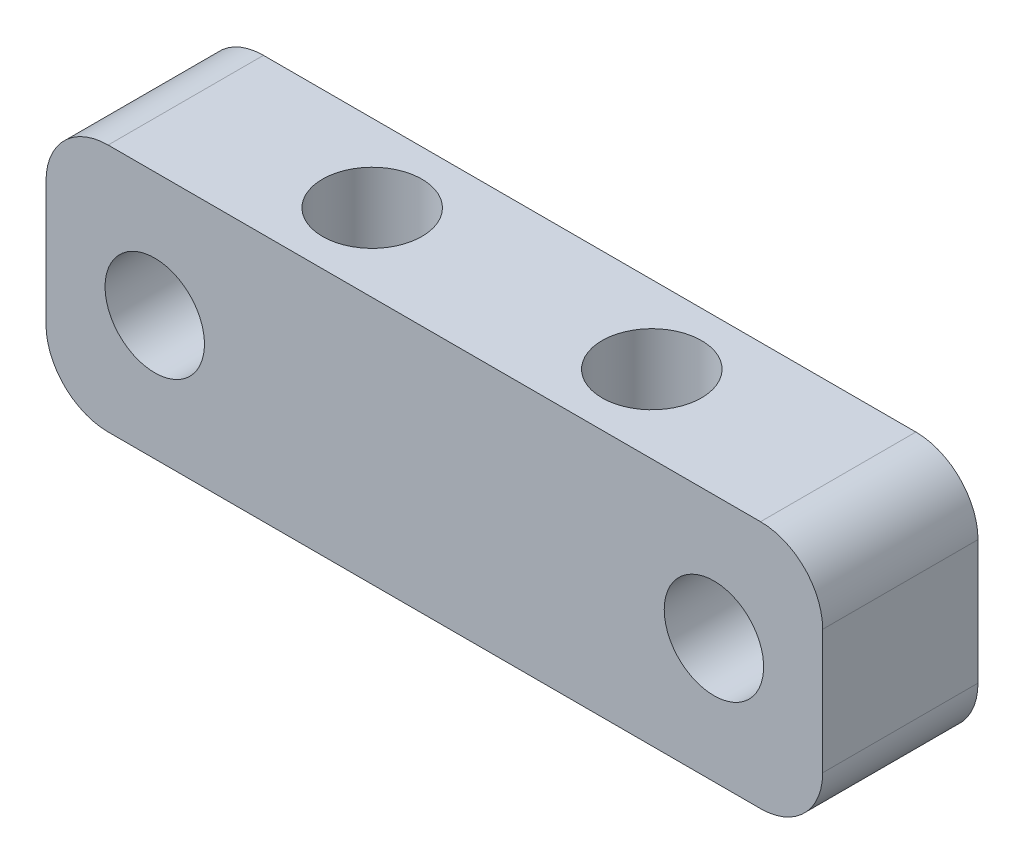
ISO-10303-21;
HEADER;
FILE_DESCRIPTION(('STEP AP214'),'2;1');
FILE_NAME('part.step','',(''),(''),'','','');
FILE_SCHEMA(('AUTOMOTIVE_DESIGN { 1 0 10303 214 1 1 1 1 }'));
ENDSEC;
DATA;
#1=APPLICATION_CONTEXT('core data for automotive mechanical design processes');
#2=APPLICATION_PROTOCOL_DEFINITION('international standard','automotive_design',2000,#1);
#3=PRODUCT_CONTEXT('',#1,'mechanical');
#4=PRODUCT('Part','Part','',(#3));
#5=PRODUCT_RELATED_PRODUCT_CATEGORY('part','',(#4));
#6=PRODUCT_DEFINITION_FORMATION('','',#4);
#7=PRODUCT_DEFINITION_CONTEXT('part definition',#1,'design');
#8=PRODUCT_DEFINITION('design','',#6,#7);
#9=PRODUCT_DEFINITION_SHAPE('','',#8);
#10=(LENGTH_UNIT() NAMED_UNIT(*) SI_UNIT(.MILLI.,.METRE.));
#11=(NAMED_UNIT(*) PLANE_ANGLE_UNIT() SI_UNIT($,.RADIAN.));
#12=(NAMED_UNIT(*) SI_UNIT($,.STERADIAN.) SOLID_ANGLE_UNIT());
#13=UNCERTAINTY_MEASURE_WITH_UNIT(LENGTH_MEASURE(1.E-05),#10,'distance_accuracy_value','');
#14=(GEOMETRIC_REPRESENTATION_CONTEXT(3) GLOBAL_UNCERTAINTY_ASSIGNED_CONTEXT((#13)) GLOBAL_UNIT_ASSIGNED_CONTEXT((#10,
#11,#12)) REPRESENTATION_CONTEXT('',''));
#15=CARTESIAN_POINT('',(0.,0.,0.));
#16=DIRECTION('',(0.,0.,1.));
#17=DIRECTION('',(1.,0.,0.));
#18=AXIS2_PLACEMENT_3D('',#15,#16,#17);
#19=CARTESIAN_POINT('',(0.,8.,0.));
#20=DIRECTION('',(0.,-1.,0.));
#21=DIRECTION('',(0.,0.,-1.));
#22=AXIS2_PLACEMENT_3D('',#19,#20,#21);
#23=PLANE('',#22);
#24=DIRECTION('',(-1.,0.,0.));
#25=VECTOR('',#24,1.);
#26=CARTESIAN_POINT('',(0.,8.,-5.));
#27=LINE('',#26,#25);
#28=CARTESIAN_POINT('',(23.,8.,-5.));
#29=VERTEX_POINT('',#28);
#30=CARTESIAN_POINT('',(2.,8.,-5.));
#31=VERTEX_POINT('',#30);
#32=EDGE_CURVE('E127',#29,#31,#27,.T.);
#33=ORIENTED_EDGE('',*,*,#32,.T.);
#34=DIRECTION('',(0.,0.,1.));
#35=VECTOR('',#34,1.);
#36=CARTESIAN_POINT('',(2.,8.,0.));
#37=LINE('',#36,#35);
#38=CARTESIAN_POINT('',(2.,8.,0.));
#39=VERTEX_POINT('',#38);
#40=EDGE_CURVE('E111',#31,#39,#37,.T.);
#41=ORIENTED_EDGE('',*,*,#40,.T.);
#42=DIRECTION('',(1.,0.,0.));
#43=VECTOR('',#42,1.);
#44=CARTESIAN_POINT('',(0.,8.,0.));
#45=LINE('',#44,#43);
#46=CARTESIAN_POINT('',(23.,8.,0.));
#47=VERTEX_POINT('',#46);
#48=EDGE_CURVE('E125',#39,#47,#45,.T.);
#49=ORIENTED_EDGE('',*,*,#48,.T.);
#50=DIRECTION('',(0.,0.,-1.));
#51=VECTOR('',#50,1.);
#52=CARTESIAN_POINT('',(23.,8.,0.));
#53=LINE('',#52,#51);
#54=EDGE_CURVE('E129',#47,#29,#53,.T.);
#55=ORIENTED_EDGE('',*,*,#54,.T.);
#56=EDGE_LOOP('',(#33,#41,#49,#55));
#57=FACE_BOUND('',#56,.T.);
#58=CARTESIAN_POINT('',(8.,8.,-2.5));
#59=DIRECTION('',(0.,1.,0.));
#60=DIRECTION('',(0.,0.,1.));
#61=AXIS2_PLACEMENT_3D('',#58,#59,#60);
#62=CIRCLE('',#61,1.6);
#63=CARTESIAN_POINT('',(8.,8.,-0.899999999999998));
#64=VERTEX_POINT('',#63);
#65=EDGE_CURVE('E146',#64,#64,#62,.T.);
#66=ORIENTED_EDGE('',*,*,#65,.F.);
#67=EDGE_LOOP('',(#66));
#68=FACE_BOUND('',#67,.T.);
#69=CARTESIAN_POINT('',(17.,8.,-2.5));
#70=DIRECTION('',(0.,1.,0.));
#71=DIRECTION('',(0.,0.,1.));
#72=AXIS2_PLACEMENT_3D('',#69,#70,#71);
#73=CIRCLE('',#72,1.6);
#74=CARTESIAN_POINT('',(17.,8.,-0.899999999999998));
#75=VERTEX_POINT('',#74);
#76=EDGE_CURVE('E246',#75,#75,#73,.T.);
#77=ORIENTED_EDGE('',*,*,#76,.F.);
#78=EDGE_LOOP('',(#77));
#79=FACE_BOUND('',#78,.T.);
#80=ADVANCED_FACE('F41',(#57,#68,#79),#23,.F.);
#81=CARTESIAN_POINT('',(0.,0.,0.));
#82=DIRECTION('',(0.,-1.,0.));
#83=DIRECTION('',(0.,0.,-1.));
#84=AXIS2_PLACEMENT_3D('',#81,#82,#83);
#85=PLANE('',#84);
#86=CARTESIAN_POINT('',(8.,0.,-2.5));
#87=DIRECTION('',(0.,1.,0.));
#88=DIRECTION('',(0.,0.,1.));
#89=AXIS2_PLACEMENT_3D('',#86,#87,#88);
#90=CIRCLE('',#89,1.6);
#91=CARTESIAN_POINT('',(8.,0.,-0.899999999999998));
#92=VERTEX_POINT('',#91);
#93=EDGE_CURVE('E142',#92,#92,#90,.T.);
#94=ORIENTED_EDGE('',*,*,#93,.T.);
#95=EDGE_LOOP('',(#94));
#96=FACE_BOUND('',#95,.T.);
#97=DIRECTION('',(1.,0.,0.));
#98=VECTOR('',#97,1.);
#99=CARTESIAN_POINT('',(0.,0.,0.));
#100=LINE('',#99,#98);
#101=CARTESIAN_POINT('',(2.,0.,0.));
#102=VERTEX_POINT('',#101);
#103=CARTESIAN_POINT('',(23.,0.,0.));
#104=VERTEX_POINT('',#103);
#105=EDGE_CURVE('E139',#102,#104,#100,.T.);
#106=ORIENTED_EDGE('',*,*,#105,.F.);
#107=DIRECTION('',(0.,0.,1.));
#108=VECTOR('',#107,1.);
#109=CARTESIAN_POINT('',(2.,0.,-5.));
#110=LINE('',#109,#108);
#111=CARTESIAN_POINT('',(2.,0.,-5.));
#112=VERTEX_POINT('',#111);
#113=EDGE_CURVE('E173',#102,#112,#110,.F.);
#114=ORIENTED_EDGE('',*,*,#113,.T.);
#115=DIRECTION('',(-1.,0.,0.));
#116=VECTOR('',#115,1.);
#117=CARTESIAN_POINT('',(0.,0.,-5.));
#118=LINE('',#117,#116);
#119=CARTESIAN_POINT('',(23.,0.,-5.));
#120=VERTEX_POINT('',#119);
#121=EDGE_CURVE('E134',#120,#112,#118,.T.);
#122=ORIENTED_EDGE('',*,*,#121,.F.);
#123=DIRECTION('',(0.,0.,-1.));
#124=VECTOR('',#123,1.);
#125=CARTESIAN_POINT('',(23.,0.,0.));
#126=LINE('',#125,#124);
#127=EDGE_CURVE('E171',#120,#104,#126,.F.);
#128=ORIENTED_EDGE('',*,*,#127,.T.);
#129=EDGE_LOOP('',(#106,#114,#122,#128));
#130=FACE_BOUND('',#129,.T.);
#131=CARTESIAN_POINT('',(17.,0.,-2.5));
#132=DIRECTION('',(0.,1.,0.));
#133=DIRECTION('',(0.,0.,1.));
#134=AXIS2_PLACEMENT_3D('',#131,#132,#133);
#135=CIRCLE('',#134,1.6);
#136=CARTESIAN_POINT('',(17.,0.,-0.899999999999998));
#137=VERTEX_POINT('',#136);
#138=EDGE_CURVE('E249',#137,#137,#135,.T.);
#139=ORIENTED_EDGE('',*,*,#138,.T.);
#140=EDGE_LOOP('',(#139));
#141=FACE_BOUND('',#140,.T.);
#142=ADVANCED_FACE('F190',(#96,#130,#141),#85,.T.);
#143=CARTESIAN_POINT('',(0.,8.,0.));
#144=DIRECTION('',(1.,0.,0.));
#145=DIRECTION('',(0.,0.,-1.));
#146=AXIS2_PLACEMENT_3D('',#143,#144,#145);
#147=PLANE('',#146);
#148=DIRECTION('',(0.,-1.,0.));
#149=VECTOR('',#148,1.);
#150=CARTESIAN_POINT('',(0.,8.,0.));
#151=LINE('',#150,#149);
#152=CARTESIAN_POINT('',(0.,6.,0.));
#153=VERTEX_POINT('',#152);
#154=CARTESIAN_POINT('',(0.,2.,0.));
#155=VERTEX_POINT('',#154);
#156=EDGE_CURVE('E155',#153,#155,#151,.T.);
#157=ORIENTED_EDGE('',*,*,#156,.F.);
#158=DIRECTION('',(0.,0.,1.));
#159=VECTOR('',#158,1.);
#160=CARTESIAN_POINT('',(0.,6.,0.));
#161=LINE('',#160,#159);
#162=CARTESIAN_POINT('',(0.,6.,-5.));
#163=VERTEX_POINT('',#162);
#164=EDGE_CURVE('E112',#153,#163,#161,.F.);
#165=ORIENTED_EDGE('',*,*,#164,.T.);
#166=DIRECTION('',(0.,-1.,0.));
#167=VECTOR('',#166,1.);
#168=CARTESIAN_POINT('',(0.,8.,-5.));
#169=LINE('',#168,#167);
#170=CARTESIAN_POINT('',(0.,2.,-5.));
#171=VERTEX_POINT('',#170);
#172=EDGE_CURVE('E136',#163,#171,#169,.T.);
#173=ORIENTED_EDGE('',*,*,#172,.T.);
#174=DIRECTION('',(0.,0.,1.));
#175=VECTOR('',#174,1.);
#176=CARTESIAN_POINT('',(0.,2.,0.));
#177=LINE('',#176,#175);
#178=EDGE_CURVE('E117',#171,#155,#177,.T.);
#179=ORIENTED_EDGE('',*,*,#178,.T.);
#180=EDGE_LOOP('',(#157,#165,#173,#179));
#181=FACE_BOUND('',#180,.T.);
#182=ADVANCED_FACE('F184',(#181),#147,.F.);
#183=CARTESIAN_POINT('',(0.,8.,0.));
#184=DIRECTION('',(0.,0.,-1.));
#185=DIRECTION('',(-1.,0.,0.));
#186=AXIS2_PLACEMENT_3D('',#183,#184,#185);
#187=PLANE('',#186);
#188=CARTESIAN_POINT('',(3.5,4.,0.));
#189=DIRECTION('',(0.,0.,-1.));
#190=DIRECTION('',(-1.,0.,0.));
#191=AXIS2_PLACEMENT_3D('',#188,#189,#190);
#192=CIRCLE('',#191,1.6);
#193=CARTESIAN_POINT('',(1.9,4.,0.));
#194=VERTEX_POINT('',#193);
#195=EDGE_CURVE('E250',#194,#194,#192,.T.);
#196=ORIENTED_EDGE('',*,*,#195,.T.);
#197=EDGE_LOOP('',(#196));
#198=FACE_BOUND('',#197,.T.);
#199=CARTESIAN_POINT('',(21.5,4.,0.));
#200=DIRECTION('',(0.,0.,-1.));
#201=DIRECTION('',(-1.,0.,0.));
#202=AXIS2_PLACEMENT_3D('',#199,#200,#201);
#203=CIRCLE('',#202,1.6);
#204=CARTESIAN_POINT('',(19.9,4.,0.));
#205=VERTEX_POINT('',#204);
#206=EDGE_CURVE('E254',#205,#205,#203,.T.);
#207=ORIENTED_EDGE('',*,*,#206,.T.);
#208=EDGE_LOOP('',(#207));
#209=FACE_BOUND('',#208,.T.);
#210=ORIENTED_EDGE('',*,*,#48,.F.);
#211=CARTESIAN_POINT('',(2.,6.,0.));
#212=DIRECTION('',(0.,0.,-1.));
#213=DIRECTION('',(-1.,0.,0.));
#214=AXIS2_PLACEMENT_3D('',#211,#212,#213);
#215=CIRCLE('',#214,2.);
#216=EDGE_CURVE('E107',#39,#153,#215,.F.);
#217=ORIENTED_EDGE('',*,*,#216,.T.);
#218=ORIENTED_EDGE('',*,*,#156,.T.);
#219=CARTESIAN_POINT('',(2.,2.,0.));
#220=DIRECTION('',(0.,0.,-1.));
#221=DIRECTION('',(-1.,0.,0.));
#222=AXIS2_PLACEMENT_3D('',#219,#220,#221);
#223=CIRCLE('',#222,2.);
#224=EDGE_CURVE('E118',#155,#102,#223,.F.);
#225=ORIENTED_EDGE('',*,*,#224,.T.);
#226=ORIENTED_EDGE('',*,*,#105,.T.);
#227=CARTESIAN_POINT('',(23.,2.,0.));
#228=DIRECTION('',(0.,0.,-1.));
#229=DIRECTION('',(-1.,0.,0.));
#230=AXIS2_PLACEMENT_3D('',#227,#228,#229);
#231=CIRCLE('',#230,2.);
#232=CARTESIAN_POINT('',(25.,2.,0.));
#233=VERTEX_POINT('',#232);
#234=EDGE_CURVE('E159',#104,#233,#231,.F.);
#235=ORIENTED_EDGE('',*,*,#234,.T.);
#236=DIRECTION('',(0.,-1.,0.));
#237=VECTOR('',#236,1.);
#238=CARTESIAN_POINT('',(25.,8.,0.));
#239=LINE('',#238,#237);
#240=CARTESIAN_POINT('',(25.,6.,0.));
#241=VERTEX_POINT('',#240);
#242=EDGE_CURVE('E152',#241,#233,#239,.T.);
#243=ORIENTED_EDGE('',*,*,#242,.F.);
#244=CARTESIAN_POINT('',(23.,6.,0.));
#245=DIRECTION('',(0.,0.,-1.));
#246=DIRECTION('',(-1.,0.,0.));
#247=AXIS2_PLACEMENT_3D('',#244,#245,#246);
#248=CIRCLE('',#247,2.);
#249=EDGE_CURVE('E128',#241,#47,#248,.F.);
#250=ORIENTED_EDGE('',*,*,#249,.T.);
#251=EDGE_LOOP('',(#210,#217,#218,#225,#226,#235,#243,#250));
#252=FACE_BOUND('',#251,.T.);
#253=ADVANCED_FACE('F131',(#198,#209,#252),#187,.F.);
#254=CARTESIAN_POINT('',(25.,8.,0.));
#255=DIRECTION('',(-1.,0.,0.));
#256=DIRECTION('',(0.,0.,1.));
#257=AXIS2_PLACEMENT_3D('',#254,#255,#256);
#258=PLANE('',#257);
#259=ORIENTED_EDGE('',*,*,#242,.T.);
#260=DIRECTION('',(0.,0.,-1.));
#261=VECTOR('',#260,1.);
#262=CARTESIAN_POINT('',(25.,2.,-5.));
#263=LINE('',#262,#261);
#264=CARTESIAN_POINT('',(25.,2.,-5.));
#265=VERTEX_POINT('',#264);
#266=EDGE_CURVE('E11',#233,#265,#263,.T.);
#267=ORIENTED_EDGE('',*,*,#266,.T.);
#268=DIRECTION('',(0.,-1.,0.));
#269=VECTOR('',#268,1.);
#270=CARTESIAN_POINT('',(25.,8.,-5.));
#271=LINE('',#270,#269);
#272=CARTESIAN_POINT('',(25.,6.,-5.));
#273=VERTEX_POINT('',#272);
#274=EDGE_CURVE('E150',#273,#265,#271,.T.);
#275=ORIENTED_EDGE('',*,*,#274,.F.);
#276=DIRECTION('',(0.,0.,-1.));
#277=VECTOR('',#276,1.);
#278=CARTESIAN_POINT('',(25.,6.,0.));
#279=LINE('',#278,#277);
#280=EDGE_CURVE('E49',#273,#241,#279,.F.);
#281=ORIENTED_EDGE('',*,*,#280,.T.);
#282=EDGE_LOOP('',(#259,#267,#275,#281));
#283=FACE_BOUND('',#282,.T.);
#284=ADVANCED_FACE('F176',(#283),#258,.F.);
#285=CARTESIAN_POINT('',(0.,8.,-5.));
#286=DIRECTION('',(0.,0.,1.));
#287=DIRECTION('',(1.,0.,0.));
#288=AXIS2_PLACEMENT_3D('',#285,#286,#287);
#289=PLANE('',#288);
#290=CARTESIAN_POINT('',(3.5,4.,-5.));
#291=DIRECTION('',(0.,0.,-1.));
#292=DIRECTION('',(-1.,0.,0.));
#293=AXIS2_PLACEMENT_3D('',#290,#291,#292);
#294=CIRCLE('',#293,1.6);
#295=CARTESIAN_POINT('',(1.9,4.,-5.));
#296=VERTEX_POINT('',#295);
#297=EDGE_CURVE('E265',#296,#296,#294,.T.);
#298=ORIENTED_EDGE('',*,*,#297,.F.);
#299=EDGE_LOOP('',(#298));
#300=FACE_BOUND('',#299,.T.);
#301=CARTESIAN_POINT('',(21.5,4.,-5.));
#302=DIRECTION('',(0.,0.,-1.));
#303=DIRECTION('',(-1.,0.,0.));
#304=AXIS2_PLACEMENT_3D('',#301,#302,#303);
#305=CIRCLE('',#304,1.6);
#306=CARTESIAN_POINT('',(19.9,4.,-5.));
#307=VERTEX_POINT('',#306);
#308=EDGE_CURVE('E266',#307,#307,#305,.T.);
#309=ORIENTED_EDGE('',*,*,#308,.F.);
#310=EDGE_LOOP('',(#309));
#311=FACE_BOUND('',#310,.T.);
#312=ORIENTED_EDGE('',*,*,#172,.F.);
#313=CARTESIAN_POINT('',(2.,6.,-5.));
#314=DIRECTION('',(0.,0.,1.));
#315=DIRECTION('',(1.,0.,0.));
#316=AXIS2_PLACEMENT_3D('',#313,#314,#315);
#317=CIRCLE('',#316,2.);
#318=EDGE_CURVE('E169',#163,#31,#317,.F.);
#319=ORIENTED_EDGE('',*,*,#318,.T.);
#320=ORIENTED_EDGE('',*,*,#32,.F.);
#321=CARTESIAN_POINT('',(23.,6.,-5.));
#322=DIRECTION('',(0.,0.,1.));
#323=DIRECTION('',(1.,0.,0.));
#324=AXIS2_PLACEMENT_3D('',#321,#322,#323);
#325=CIRCLE('',#324,2.);
#326=EDGE_CURVE('E63',#29,#273,#325,.F.);
#327=ORIENTED_EDGE('',*,*,#326,.T.);
#328=ORIENTED_EDGE('',*,*,#274,.T.);
#329=CARTESIAN_POINT('',(23.,2.,-5.));
#330=DIRECTION('',(0.,0.,1.));
#331=DIRECTION('',(1.,0.,0.));
#332=AXIS2_PLACEMENT_3D('',#329,#330,#331);
#333=CIRCLE('',#332,2.);
#334=EDGE_CURVE('E56',#265,#120,#333,.F.);
#335=ORIENTED_EDGE('',*,*,#334,.T.);
#336=ORIENTED_EDGE('',*,*,#121,.T.);
#337=CARTESIAN_POINT('',(2.,2.,-5.));
#338=DIRECTION('',(0.,0.,1.));
#339=DIRECTION('',(1.,0.,0.));
#340=AXIS2_PLACEMENT_3D('',#337,#338,#339);
#341=CIRCLE('',#340,2.);
#342=EDGE_CURVE('E167',#112,#171,#341,.F.);
#343=ORIENTED_EDGE('',*,*,#342,.T.);
#344=EDGE_LOOP('',(#312,#319,#320,#327,#328,#335,#336,#343));
#345=FACE_BOUND('',#344,.T.);
#346=ADVANCED_FACE('F180',(#300,#311,#345),#289,.F.);
#347=CARTESIAN_POINT('',(8.,8.,-2.5));
#348=DIRECTION('',(0.,-1.,0.));
#349=DIRECTION('',(0.,0.,-1.));
#350=AXIS2_PLACEMENT_3D('',#347,#348,#349);
#351=CYLINDRICAL_SURFACE('',#350,1.6);
#352=ORIENTED_EDGE('',*,*,#65,.T.);
#353=EDGE_LOOP('',(#352));
#354=FACE_BOUND('',#353,.T.);
#355=ORIENTED_EDGE('',*,*,#93,.F.);
#356=EDGE_LOOP('',(#355));
#357=FACE_BOUND('',#356,.T.);
#358=ADVANCED_FACE('F208',(#354,#357),#351,.F.);
#359=CARTESIAN_POINT('',(17.,8.,-2.5));
#360=DIRECTION('',(0.,-1.,0.));
#361=DIRECTION('',(0.,0.,-1.));
#362=AXIS2_PLACEMENT_3D('',#359,#360,#361);
#363=CYLINDRICAL_SURFACE('',#362,1.6);
#364=ORIENTED_EDGE('',*,*,#76,.T.);
#365=EDGE_LOOP('',(#364));
#366=FACE_BOUND('',#365,.T.);
#367=ORIENTED_EDGE('',*,*,#138,.F.);
#368=EDGE_LOOP('',(#367));
#369=FACE_BOUND('',#368,.T.);
#370=ADVANCED_FACE('F232',(#366,#369),#363,.F.);
#371=CARTESIAN_POINT('',(21.5,4.,3.));
#372=DIRECTION('',(0.,0.,-1.));
#373=DIRECTION('',(-1.,0.,0.));
#374=AXIS2_PLACEMENT_3D('',#371,#372,#373);
#375=CYLINDRICAL_SURFACE('',#374,1.6);
#376=ORIENTED_EDGE('',*,*,#308,.T.);
#377=EDGE_LOOP('',(#376));
#378=FACE_BOUND('',#377,.T.);
#379=ORIENTED_EDGE('',*,*,#206,.F.);
#380=EDGE_LOOP('',(#379));
#381=FACE_BOUND('',#380,.T.);
#382=ADVANCED_FACE('F226',(#378,#381),#375,.F.);
#383=CARTESIAN_POINT('',(3.5,4.,3.));
#384=DIRECTION('',(0.,0.,-1.));
#385=DIRECTION('',(-1.,0.,0.));
#386=AXIS2_PLACEMENT_3D('',#383,#384,#385);
#387=CYLINDRICAL_SURFACE('',#386,1.6);
#388=ORIENTED_EDGE('',*,*,#297,.T.);
#389=EDGE_LOOP('',(#388));
#390=FACE_BOUND('',#389,.T.);
#391=ORIENTED_EDGE('',*,*,#195,.F.);
#392=EDGE_LOOP('',(#391));
#393=FACE_BOUND('',#392,.T.);
#394=ADVANCED_FACE('F222',(#390,#393),#387,.F.);
#395=CARTESIAN_POINT('',(2.,6.,0.));
#396=DIRECTION('',(0.,0.,1.));
#397=DIRECTION('',(1.,0.,0.));
#398=AXIS2_PLACEMENT_3D('',#395,#396,#397);
#399=CYLINDRICAL_SURFACE('',#398,2.);
#400=ORIENTED_EDGE('',*,*,#318,.F.);
#401=ORIENTED_EDGE('',*,*,#164,.F.);
#402=ORIENTED_EDGE('',*,*,#216,.F.);
#403=ORIENTED_EDGE('',*,*,#40,.F.);
#404=EDGE_LOOP('',(#400,#401,#402,#403));
#405=FACE_BOUND('',#404,.T.);
#406=ADVANCED_FACE('F110',(#405),#399,.T.);
#407=CARTESIAN_POINT('',(2.,2.,0.));
#408=DIRECTION('',(0.,0.,-1.));
#409=DIRECTION('',(-1.,0.,0.));
#410=AXIS2_PLACEMENT_3D('',#407,#408,#409);
#411=CYLINDRICAL_SURFACE('',#410,2.);
#412=ORIENTED_EDGE('',*,*,#342,.F.);
#413=ORIENTED_EDGE('',*,*,#113,.F.);
#414=ORIENTED_EDGE('',*,*,#224,.F.);
#415=ORIENTED_EDGE('',*,*,#178,.F.);
#416=EDGE_LOOP('',(#412,#413,#414,#415));
#417=FACE_BOUND('',#416,.T.);
#418=ADVANCED_FACE('F186',(#417),#411,.T.);
#419=CARTESIAN_POINT('',(23.,2.,0.));
#420=DIRECTION('',(0.,0.,1.));
#421=DIRECTION('',(1.,0.,0.));
#422=AXIS2_PLACEMENT_3D('',#419,#420,#421);
#423=CYLINDRICAL_SURFACE('',#422,2.);
#424=ORIENTED_EDGE('',*,*,#234,.F.);
#425=ORIENTED_EDGE('',*,*,#127,.F.);
#426=ORIENTED_EDGE('',*,*,#334,.F.);
#427=ORIENTED_EDGE('',*,*,#266,.F.);
#428=EDGE_LOOP('',(#424,#425,#426,#427));
#429=FACE_BOUND('',#428,.T.);
#430=ADVANCED_FACE('F193',(#429),#423,.T.);
#431=CARTESIAN_POINT('',(23.,6.,0.));
#432=DIRECTION('',(0.,0.,-1.));
#433=DIRECTION('',(-1.,0.,0.));
#434=AXIS2_PLACEMENT_3D('',#431,#432,#433);
#435=CYLINDRICAL_SURFACE('',#434,2.);
#436=ORIENTED_EDGE('',*,*,#249,.F.);
#437=ORIENTED_EDGE('',*,*,#280,.F.);
#438=ORIENTED_EDGE('',*,*,#326,.F.);
#439=ORIENTED_EDGE('',*,*,#54,.F.);
#440=EDGE_LOOP('',(#436,#437,#438,#439));
#441=FACE_BOUND('',#440,.T.);
#442=ADVANCED_FACE('F43',(#441),#435,.T.);
#443=CLOSED_SHELL('',(#80,#142,#182,#253,#284,#346,#358,#370,#382,#394,#406,#418,#430,#442));
#444=MANIFOLD_SOLID_BREP('B2',#443);
#445=ADVANCED_BREP_SHAPE_REPRESENTATION('',(#18,#444),#14);
#446=SHAPE_DEFINITION_REPRESENTATION(#9,#445);
ENDSEC;
END-ISO-10303-21;
